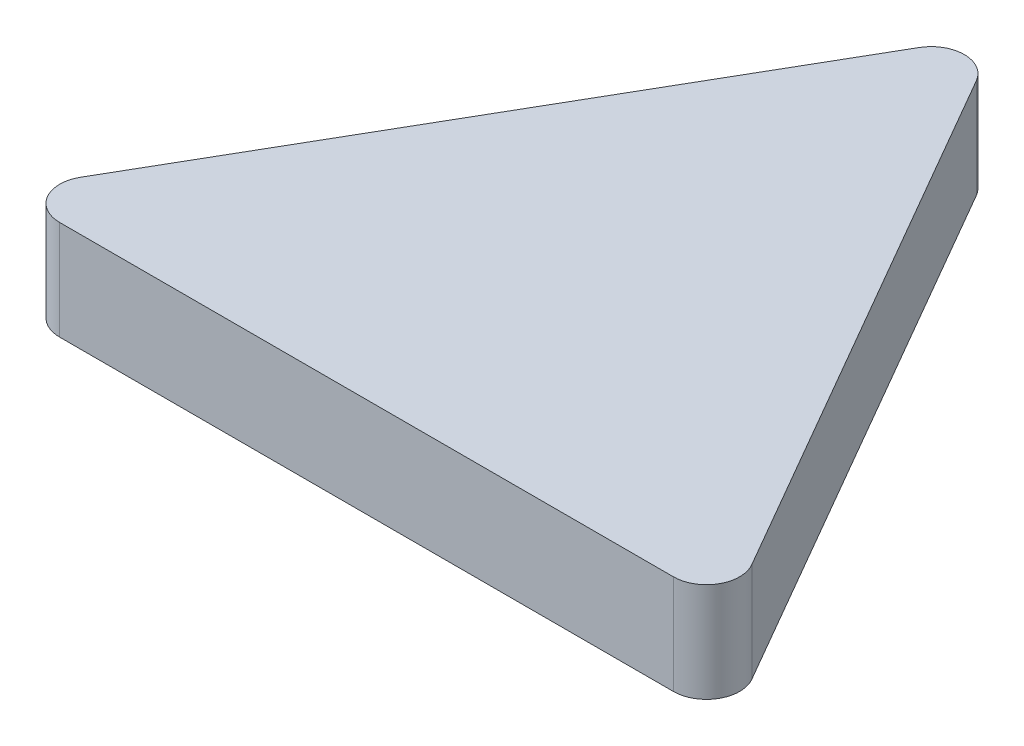
ISO-10303-21;
HEADER;
FILE_DESCRIPTION(('STEP AP214'),'2;1');
FILE_NAME('part.step','',(''),(''),'','','');
FILE_SCHEMA(('AUTOMOTIVE_DESIGN { 1 0 10303 214 1 1 1 1 }'));
ENDSEC;
DATA;
#1=APPLICATION_CONTEXT('core data for automotive mechanical design processes');
#2=APPLICATION_PROTOCOL_DEFINITION('international standard','automotive_design',2000,#1);
#3=PRODUCT_CONTEXT('',#1,'mechanical');
#4=PRODUCT('Part','Part','',(#3));
#5=PRODUCT_RELATED_PRODUCT_CATEGORY('part','',(#4));
#6=PRODUCT_DEFINITION_FORMATION('','',#4);
#7=PRODUCT_DEFINITION_CONTEXT('part definition',#1,'design');
#8=PRODUCT_DEFINITION('design','',#6,#7);
#9=PRODUCT_DEFINITION_SHAPE('','',#8);
#10=(LENGTH_UNIT() NAMED_UNIT(*) SI_UNIT(.MILLI.,.METRE.));
#11=(NAMED_UNIT(*) PLANE_ANGLE_UNIT() SI_UNIT($,.RADIAN.));
#12=(NAMED_UNIT(*) SI_UNIT($,.STERADIAN.) SOLID_ANGLE_UNIT());
#13=UNCERTAINTY_MEASURE_WITH_UNIT(LENGTH_MEASURE(1.E-05),#10,'distance_accuracy_value','');
#14=(GEOMETRIC_REPRESENTATION_CONTEXT(3) GLOBAL_UNCERTAINTY_ASSIGNED_CONTEXT((#13)) GLOBAL_UNIT_ASSIGNED_CONTEXT((#10,
#11,#12)) REPRESENTATION_CONTEXT('',''));
#15=CARTESIAN_POINT('',(0.,0.,0.));
#16=DIRECTION('',(0.,0.,1.));
#17=DIRECTION('',(1.,0.,0.));
#18=AXIS2_PLACEMENT_3D('',#15,#16,#17);
#19=CARTESIAN_POINT('',(0.,19.05,-67.9558326057907));
#20=DIRECTION('',(0.,-1.,0.));
#21=DIRECTION('',(0.,0.,-1.));
#22=AXIS2_PLACEMENT_3D('',#19,#20,#21);
#23=CYLINDRICAL_SURFACE('',#22,6.35);
#24=CARTESIAN_POINT('',(0.,0.,-67.9558326057907));
#25=DIRECTION('',(0.,1.,0.));
#26=DIRECTION('',(0.,0.,1.));
#27=AXIS2_PLACEMENT_3D('',#24,#25,#26);
#28=CIRCLE('',#27,6.35);
#29=CARTESIAN_POINT('',(5.49926131403118,0.,-71.1308326057907));
#30=VERTEX_POINT('',#29);
#31=CARTESIAN_POINT('',(-5.4992613140312,0.,-71.1308326057907));
#32=VERTEX_POINT('',#31);
#33=EDGE_CURVE('E128',#30,#32,#28,.T.);
#34=ORIENTED_EDGE('',*,*,#33,.T.);
#35=DIRECTION('',(0.,-1.,0.));
#36=VECTOR('',#35,1.);
#37=CARTESIAN_POINT('',(-5.4992613140312,19.05,-71.1308326057907));
#38=LINE('',#37,#36);
#39=CARTESIAN_POINT('',(-5.4992613140312,19.05,-71.1308326057907));
#40=VERTEX_POINT('',#39);
#41=EDGE_CURVE('E11',#40,#32,#38,.T.);
#42=ORIENTED_EDGE('',*,*,#41,.F.);
#43=CARTESIAN_POINT('',(0.,19.05,-67.9558326057907));
#44=DIRECTION('',(0.,1.,0.));
#45=DIRECTION('',(0.,0.,1.));
#46=AXIS2_PLACEMENT_3D('',#43,#44,#45);
#47=CIRCLE('',#46,6.35);
#48=CARTESIAN_POINT('',(5.49926131403118,19.05,-71.1308326057907));
#49=VERTEX_POINT('',#48);
#50=EDGE_CURVE('E144',#49,#40,#47,.T.);
#51=ORIENTED_EDGE('',*,*,#50,.F.);
#52=DIRECTION('',(0.,-1.,0.));
#53=VECTOR('',#52,1.);
#54=CARTESIAN_POINT('',(5.49926131403118,19.05,-71.1308326057907));
#55=LINE('',#54,#53);
#56=EDGE_CURVE('E124',#49,#30,#55,.T.);
#57=ORIENTED_EDGE('',*,*,#56,.T.);
#58=EDGE_LOOP('',(#34,#42,#51,#57));
#59=FACE_BOUND('',#58,.T.);
#60=ADVANCED_FACE('F39',(#59),#23,.T.);
#61=CARTESIAN_POINT('',(-5.4992613140312,19.05,-71.1308326057907));
#62=DIRECTION('',(0.866025403784439,0.,0.5));
#63=DIRECTION('',(0.5,0.,-0.866025403784439));
#64=AXIS2_PLACEMENT_3D('',#61,#62,#63);
#65=PLANE('',#64);
#66=DIRECTION('',(-0.5,0.,0.866025403784439));
#67=VECTOR('',#66,1.);
#68=CARTESIAN_POINT('',(-5.4992613140312,0.,-71.1308326057907));
#69=LINE('',#68,#67);
#70=CARTESIAN_POINT('',(-64.3507386859688,0.,30.8029163028953));
#71=VERTEX_POINT('',#70);
#72=EDGE_CURVE('E132',#32,#71,#69,.T.);
#73=ORIENTED_EDGE('',*,*,#72,.T.);
#74=DIRECTION('',(0.,-1.,0.));
#75=VECTOR('',#74,1.);
#76=CARTESIAN_POINT('',(-64.3507386859688,19.05,30.8029163028953));
#77=LINE('',#76,#75);
#78=CARTESIAN_POINT('',(-64.3507386859688,19.05,30.8029163028953));
#79=VERTEX_POINT('',#78);
#80=EDGE_CURVE('E48',#79,#71,#77,.T.);
#81=ORIENTED_EDGE('',*,*,#80,.F.);
#82=DIRECTION('',(-0.5,0.,0.866025403784439));
#83=VECTOR('',#82,1.);
#84=CARTESIAN_POINT('',(-5.4992613140312,19.05,-71.1308326057907));
#85=LINE('',#84,#83);
#86=EDGE_CURVE('E93',#40,#79,#85,.T.);
#87=ORIENTED_EDGE('',*,*,#86,.F.);
#88=ORIENTED_EDGE('',*,*,#41,.T.);
#89=EDGE_LOOP('',(#73,#81,#87,#88));
#90=FACE_BOUND('',#89,.T.);
#91=ADVANCED_FACE('F172',(#90),#65,.F.);
#92=CARTESIAN_POINT('',(-58.8514773719376,19.05,33.9779163028953));
#93=DIRECTION('',(0.,-1.,0.));
#94=DIRECTION('',(0.,0.,-1.));
#95=AXIS2_PLACEMENT_3D('',#92,#93,#94);
#96=CYLINDRICAL_SURFACE('',#95,6.35000000000001);
#97=CARTESIAN_POINT('',(-58.8514773719376,0.,33.9779163028953));
#98=DIRECTION('',(0.,1.,0.));
#99=DIRECTION('',(0.,0.,1.));
#100=AXIS2_PLACEMENT_3D('',#97,#98,#99);
#101=CIRCLE('',#100,6.35000000000001);
#102=CARTESIAN_POINT('',(-58.8514773719376,0.,40.3279163028954));
#103=VERTEX_POINT('',#102);
#104=EDGE_CURVE('E135',#71,#103,#101,.T.);
#105=ORIENTED_EDGE('',*,*,#104,.T.);
#106=DIRECTION('',(0.,-1.,0.));
#107=VECTOR('',#106,1.);
#108=CARTESIAN_POINT('',(-58.8514773719376,19.05,40.3279163028954));
#109=LINE('',#108,#107);
#110=CARTESIAN_POINT('',(-58.8514773719376,19.05,40.3279163028954));
#111=VERTEX_POINT('',#110);
#112=EDGE_CURVE('E117',#111,#103,#109,.T.);
#113=ORIENTED_EDGE('',*,*,#112,.F.);
#114=CARTESIAN_POINT('',(-58.8514773719376,19.05,33.9779163028953));
#115=DIRECTION('',(0.,1.,0.));
#116=DIRECTION('',(0.,0.,1.));
#117=AXIS2_PLACEMENT_3D('',#114,#115,#116);
#118=CIRCLE('',#117,6.35000000000001);
#119=EDGE_CURVE('E106',#79,#111,#118,.T.);
#120=ORIENTED_EDGE('',*,*,#119,.F.);
#121=ORIENTED_EDGE('',*,*,#80,.T.);
#122=EDGE_LOOP('',(#105,#113,#120,#121));
#123=FACE_BOUND('',#122,.T.);
#124=ADVANCED_FACE('F154',(#123),#96,.T.);
#125=CARTESIAN_POINT('',(-58.8514773719376,19.05,40.3279163028954));
#126=DIRECTION('',(0.,0.,-1.));
#127=DIRECTION('',(-1.,0.,0.));
#128=AXIS2_PLACEMENT_3D('',#125,#126,#127);
#129=PLANE('',#128);
#130=DIRECTION('',(1.,0.,0.));
#131=VECTOR('',#130,1.);
#132=CARTESIAN_POINT('',(-58.8514773719376,0.,40.3279163028954));
#133=LINE('',#132,#131);
#134=CARTESIAN_POINT('',(58.8514773719376,0.,40.3279163028953));
#135=VERTEX_POINT('',#134);
#136=EDGE_CURVE('E115',#103,#135,#133,.T.);
#137=ORIENTED_EDGE('',*,*,#136,.T.);
#138=DIRECTION('',(0.,-1.,0.));
#139=VECTOR('',#138,1.);
#140=CARTESIAN_POINT('',(58.8514773719376,19.05,40.3279163028953));
#141=LINE('',#140,#139);
#142=CARTESIAN_POINT('',(58.8514773719376,19.05,40.3279163028953));
#143=VERTEX_POINT('',#142);
#144=EDGE_CURVE('E112',#143,#135,#141,.T.);
#145=ORIENTED_EDGE('',*,*,#144,.F.);
#146=DIRECTION('',(1.,0.,0.));
#147=VECTOR('',#146,1.);
#148=CARTESIAN_POINT('',(-58.8514773719376,19.05,40.3279163028954));
#149=LINE('',#148,#147);
#150=EDGE_CURVE('E100',#111,#143,#149,.T.);
#151=ORIENTED_EDGE('',*,*,#150,.F.);
#152=ORIENTED_EDGE('',*,*,#112,.T.);
#153=EDGE_LOOP('',(#137,#145,#151,#152));
#154=FACE_BOUND('',#153,.T.);
#155=ADVANCED_FACE('F113',(#154),#129,.F.);
#156=CARTESIAN_POINT('',(58.8514773719376,19.05,33.9779163028954));
#157=DIRECTION('',(0.,-1.,0.));
#158=DIRECTION('',(0.,0.,-1.));
#159=AXIS2_PLACEMENT_3D('',#156,#157,#158);
#160=CYLINDRICAL_SURFACE('',#159,6.34999999999999);
#161=CARTESIAN_POINT('',(58.8514773719376,0.,33.9779163028954));
#162=DIRECTION('',(0.,1.,0.));
#163=DIRECTION('',(0.,0.,1.));
#164=AXIS2_PLACEMENT_3D('',#161,#162,#163);
#165=CIRCLE('',#164,6.34999999999999);
#166=CARTESIAN_POINT('',(64.3507386859688,0.,30.8029163028953));
#167=VERTEX_POINT('',#166);
#168=EDGE_CURVE('E79',#135,#167,#165,.T.);
#169=ORIENTED_EDGE('',*,*,#168,.T.);
#170=DIRECTION('',(0.,-1.,0.));
#171=VECTOR('',#170,1.);
#172=CARTESIAN_POINT('',(64.3507386859688,19.05,30.8029163028953));
#173=LINE('',#172,#171);
#174=CARTESIAN_POINT('',(64.3507386859688,19.05,30.8029163028953));
#175=VERTEX_POINT('',#174);
#176=EDGE_CURVE('E118',#175,#167,#173,.T.);
#177=ORIENTED_EDGE('',*,*,#176,.F.);
#178=CARTESIAN_POINT('',(58.8514773719376,19.05,33.9779163028954));
#179=DIRECTION('',(0.,1.,0.));
#180=DIRECTION('',(0.,0.,1.));
#181=AXIS2_PLACEMENT_3D('',#178,#179,#180);
#182=CIRCLE('',#181,6.34999999999999);
#183=EDGE_CURVE('E104',#143,#175,#182,.T.);
#184=ORIENTED_EDGE('',*,*,#183,.F.);
#185=ORIENTED_EDGE('',*,*,#144,.T.);
#186=EDGE_LOOP('',(#169,#177,#184,#185));
#187=FACE_BOUND('',#186,.T.);
#188=ADVANCED_FACE('F120',(#187),#160,.T.);
#189=CARTESIAN_POINT('',(64.3507386859688,19.05,30.8029163028953));
#190=DIRECTION('',(-0.866025403784439,0.,0.5));
#191=DIRECTION('',(0.5,0.,0.866025403784439));
#192=AXIS2_PLACEMENT_3D('',#189,#190,#191);
#193=PLANE('',#192);
#194=DIRECTION('',(-0.5,0.,-0.866025403784439));
#195=VECTOR('',#194,1.);
#196=CARTESIAN_POINT('',(64.3507386859688,0.,30.8029163028953));
#197=LINE('',#196,#195);
#198=EDGE_CURVE('E85',#167,#30,#197,.T.);
#199=ORIENTED_EDGE('',*,*,#198,.T.);
#200=ORIENTED_EDGE('',*,*,#56,.F.);
#201=DIRECTION('',(-0.5,0.,-0.866025403784439));
#202=VECTOR('',#201,1.);
#203=CARTESIAN_POINT('',(64.3507386859688,19.05,30.8029163028953));
#204=LINE('',#203,#202);
#205=EDGE_CURVE('E56',#175,#49,#204,.T.);
#206=ORIENTED_EDGE('',*,*,#205,.F.);
#207=ORIENTED_EDGE('',*,*,#176,.T.);
#208=EDGE_LOOP('',(#199,#200,#206,#207));
#209=FACE_BOUND('',#208,.T.);
#210=ADVANCED_FACE('F161',(#209),#193,.F.);
#211=CARTESIAN_POINT('',(0.,19.05,-67.9558326057907));
#212=DIRECTION('',(0.,1.,0.));
#213=DIRECTION('',(0.,0.,1.));
#214=AXIS2_PLACEMENT_3D('',#211,#212,#213);
#215=PLANE('',#214);
#216=ORIENTED_EDGE('',*,*,#50,.T.);
#217=ORIENTED_EDGE('',*,*,#86,.T.);
#218=ORIENTED_EDGE('',*,*,#119,.T.);
#219=ORIENTED_EDGE('',*,*,#150,.T.);
#220=ORIENTED_EDGE('',*,*,#183,.T.);
#221=ORIENTED_EDGE('',*,*,#205,.T.);
#222=EDGE_LOOP('',(#216,#217,#218,#219,#220,#221));
#223=FACE_BOUND('',#222,.T.);
#224=ADVANCED_FACE('F102',(#223),#215,.T.);
#225=CARTESIAN_POINT('',(0.,0.,-67.9558326057907));
#226=DIRECTION('',(0.,1.,0.));
#227=DIRECTION('',(0.,0.,1.));
#228=AXIS2_PLACEMENT_3D('',#225,#226,#227);
#229=PLANE('',#228);
#230=ORIENTED_EDGE('',*,*,#33,.F.);
#231=ORIENTED_EDGE('',*,*,#198,.F.);
#232=ORIENTED_EDGE('',*,*,#168,.F.);
#233=ORIENTED_EDGE('',*,*,#136,.F.);
#234=ORIENTED_EDGE('',*,*,#104,.F.);
#235=ORIENTED_EDGE('',*,*,#72,.F.);
#236=EDGE_LOOP('',(#230,#231,#232,#233,#234,#235));
#237=FACE_BOUND('',#236,.T.);
#238=ADVANCED_FACE('F157',(#237),#229,.F.);
#239=CLOSED_SHELL('',(#60,#91,#124,#155,#188,#210,#224,#238));
#240=MANIFOLD_SOLID_BREP('B2',#239);
#241=ADVANCED_BREP_SHAPE_REPRESENTATION('',(#18,#240),#14);
#242=SHAPE_DEFINITION_REPRESENTATION(#9,#241);
ENDSEC;
END-ISO-10303-21;
